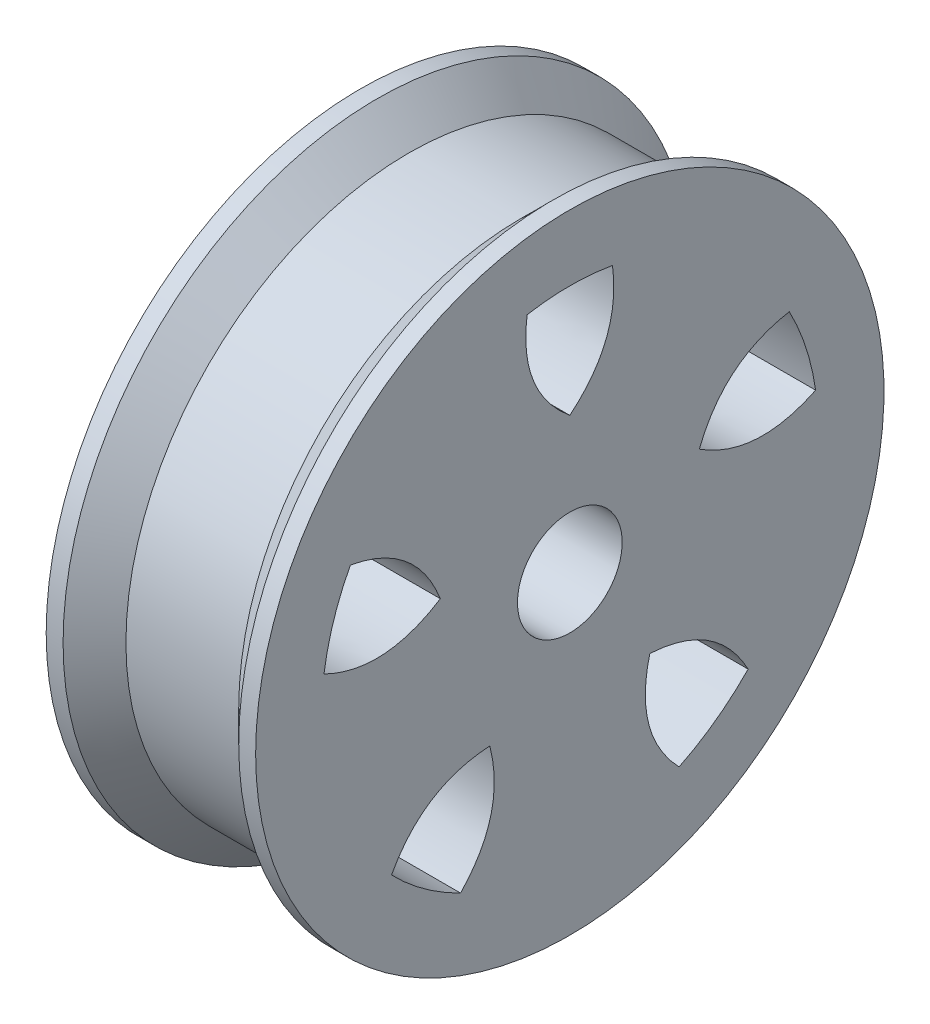
ISO-10303-21;
HEADER;
FILE_DESCRIPTION(('STEP AP214'),'2;1');
FILE_NAME('part.step','',(''),(''),'','','');
FILE_SCHEMA(('AUTOMOTIVE_DESIGN { 1 0 10303 214 1 1 1 1 }'));
ENDSEC;
DATA;
#1=APPLICATION_CONTEXT('core data for automotive mechanical design processes');
#2=APPLICATION_PROTOCOL_DEFINITION('international standard','automotive_design',2000,#1);
#3=PRODUCT_CONTEXT('',#1,'mechanical');
#4=PRODUCT('Part','Part','',(#3));
#5=PRODUCT_RELATED_PRODUCT_CATEGORY('part','',(#4));
#6=PRODUCT_DEFINITION_FORMATION('','',#4);
#7=PRODUCT_DEFINITION_CONTEXT('part definition',#1,'design');
#8=PRODUCT_DEFINITION('design','',#6,#7);
#9=PRODUCT_DEFINITION_SHAPE('','',#8);
#10=(LENGTH_UNIT() NAMED_UNIT(*) SI_UNIT(.MILLI.,.METRE.));
#11=(NAMED_UNIT(*) PLANE_ANGLE_UNIT() SI_UNIT($,.RADIAN.));
#12=(NAMED_UNIT(*) SI_UNIT($,.STERADIAN.) SOLID_ANGLE_UNIT());
#13=UNCERTAINTY_MEASURE_WITH_UNIT(LENGTH_MEASURE(1.E-05),#10,'distance_accuracy_value','');
#14=(GEOMETRIC_REPRESENTATION_CONTEXT(3) GLOBAL_UNCERTAINTY_ASSIGNED_CONTEXT((#13)) GLOBAL_UNIT_ASSIGNED_CONTEXT((#10,
#11,#12)) REPRESENTATION_CONTEXT('',''));
#15=CARTESIAN_POINT('',(0.,0.,0.));
#16=DIRECTION('',(0.,0.,1.));
#17=DIRECTION('',(1.,0.,0.));
#18=AXIS2_PLACEMENT_3D('',#15,#16,#17);
#19=CARTESIAN_POINT('',(3.,13.,0.));
#20=DIRECTION('',(1.,0.,0.));
#21=DIRECTION('',(0.,0.,-1.));
#22=AXIS2_PLACEMENT_3D('',#19,#20,#21);
#23=PLANE('',#22);
#24=CARTESIAN_POINT('',(3.,0.,0.));
#25=DIRECTION('',(-1.,0.,0.));
#26=DIRECTION('',(0.,0.,1.));
#27=AXIS2_PLACEMENT_3D('',#24,#25,#26);
#28=CIRCLE('',#27,13.);
#29=CARTESIAN_POINT('',(3.,4.01722092687444,12.3637347118369));
#30=VERTEX_POINT('',#29);
#31=CARTESIAN_POINT('',(3.,13.,0.));
#32=VERTEX_POINT('',#31);
#33=EDGE_CURVE('E150',#30,#32,#28,.T.);
#34=ORIENTED_EDGE('',*,*,#33,.F.);
#35=CARTESIAN_POINT('',(3.,11.0933574603183,20.9541045179935));
#36=CARTESIAN_POINT('',(3.,9.96753337147774,14.7007536655509));
#37=CARTESIAN_POINT('',(3.,4.01722092687444,12.3637347118369));
#38=B_SPLINE_CURVE_WITH_KNOTS('',2,(#35,#36,#37),.UNSPECIFIED.,.F.,.F.,(3,3),(0.,1.),.UNSPECIFIED.);
#39=CARTESIAN_POINT('',(3.,11.0933574603183,20.9541045179935));
#40=VERTEX_POINT('',#39);
#41=EDGE_CURVE('E129',#40,#30,#38,.T.);
#42=ORIENTED_EDGE('',*,*,#41,.F.);
#43=CARTESIAN_POINT('',(3.,0.,0.));
#44=DIRECTION('',(-1.,0.,0.));
#45=DIRECTION('',(0.,0.,1.));
#46=AXIS2_PLACEMENT_3D('',#43,#44,#45);
#47=CIRCLE('',#46,23.709430104779);
#48=CARTESIAN_POINT('',(3.,23.356573624882,4.07523550225805));
#49=VERTEX_POINT('',#48);
#50=EDGE_CURVE('E217',#40,#49,#47,.T.);
#51=ORIENTED_EDGE('',*,*,#50,.T.);
#52=CARTESIAN_POINT('',(3.,13.,0.));
#53=CARTESIAN_POINT('',(3.,17.0613847718581,4.93690485155809));
#54=CARTESIAN_POINT('',(3.,23.356573624882,4.07523550225805));
#55=B_SPLINE_CURVE_WITH_KNOTS('',2,(#52,#53,#54),.UNSPECIFIED.,.F.,.F.,(3,3),(0.,1.),.UNSPECIFIED.);
#56=EDGE_CURVE('E152',#32,#49,#55,.T.);
#57=ORIENTED_EDGE('',*,*,#56,.F.);
#58=EDGE_LOOP('',(#34,#42,#51,#57));
#59=FACE_BOUND('',#58,.T.);
#60=ADVANCED_FACE('F16',(#59),#23,.F.);
#61=CARTESIAN_POINT('',(3.,-16.5005016650531,17.025584298196));
#62=VERTEX_POINT('',#61);
#63=CARTESIAN_POINT('',(3.,3.3417989005986,23.4727385705493));
#64=VERTEX_POINT('',#63);
#65=EDGE_CURVE('E147',#62,#64,#47,.T.);
#66=ORIENTED_EDGE('',*,*,#65,.T.);
#67=CARTESIAN_POINT('',(3.,4.01722092687444,12.3637347118369));
#68=CARTESIAN_POINT('',(3.,0.576982312670811,17.7519286630382));
#69=CARTESIAN_POINT('',(3.,3.3417989005986,23.4727385705493));
#70=B_SPLINE_CURVE_WITH_KNOTS('',2,(#67,#68,#69),.UNSPECIFIED.,.F.,.F.,(3,3),(0.,1.),.UNSPECIFIED.);
#71=EDGE_CURVE('E38',#30,#64,#70,.T.);
#72=ORIENTED_EDGE('',*,*,#71,.F.);
#73=CARTESIAN_POINT('',(3.,-10.5172209268742,7.64120827980223));
#74=VERTEX_POINT('',#73);
#75=EDGE_CURVE('E144',#74,#30,#28,.T.);
#76=ORIENTED_EDGE('',*,*,#75,.F.);
#77=CARTESIAN_POINT('',(3.,-16.5005016650531,17.025584298196));
#78=CARTESIAN_POINT('',(3.,-10.901110364286,14.0224702771083));
#79=CARTESIAN_POINT('',(3.,-10.5172209268742,7.64120827980223));
#80=B_SPLINE_CURVE_WITH_KNOTS('',2,(#77,#78,#79),.UNSPECIFIED.,.F.,.F.,(3,3),(0.,1.),.UNSPECIFIED.);
#81=EDGE_CURVE('E250',#62,#74,#80,.T.);
#82=ORIENTED_EDGE('',*,*,#81,.F.);
#83=EDGE_LOOP('',(#66,#72,#76,#82));
#84=FACE_BOUND('',#83,.T.);
#85=ADVANCED_FACE('F141',(#84),#23,.F.);
#86=CARTESIAN_POINT('',(3.,-21.2912283207453,-10.431714743382));
#87=VERTEX_POINT('',#86);
#88=CARTESIAN_POINT('',(3.,-21.2912283207451,10.4317147433823));
#89=VERTEX_POINT('',#88);
#90=EDGE_CURVE('E211',#87,#89,#47,.T.);
#91=ORIENTED_EDGE('',*,*,#90,.T.);
#92=CARTESIAN_POINT('',(3.,-10.5172209268742,7.64120827980223));
#93=CARTESIAN_POINT('',(3.,-16.7047900917201,6.0343904280631));
#94=CARTESIAN_POINT('',(3.,-21.2912283207451,10.4317147433823));
#95=B_SPLINE_CURVE_WITH_KNOTS('',2,(#92,#93,#94),.UNSPECIFIED.,.F.,.F.,(3,3),(0.,1.),.UNSPECIFIED.);
#96=EDGE_CURVE('E431',#74,#89,#95,.T.);
#97=ORIENTED_EDGE('',*,*,#96,.F.);
#98=CARTESIAN_POINT('',(3.,-10.5172209268743,-7.64120827980207));
#99=VERTEX_POINT('',#98);
#100=EDGE_CURVE('E163',#99,#74,#28,.T.);
#101=ORIENTED_EDGE('',*,*,#100,.F.);
#102=CARTESIAN_POINT('',(3.,-21.2912283207453,-10.431714743382));
#103=CARTESIAN_POINT('',(3.,-16.7047900917202,-6.03439042806286));
#104=CARTESIAN_POINT('',(3.,-10.5172209268743,-7.64120827980207));
#105=B_SPLINE_CURVE_WITH_KNOTS('',2,(#102,#103,#104),.UNSPECIFIED.,.F.,.F.,(3,3),(0.,1.),.UNSPECIFIED.);
#106=EDGE_CURVE('E294',#87,#99,#105,.T.);
#107=ORIENTED_EDGE('',*,*,#106,.F.);
#108=EDGE_LOOP('',(#91,#97,#101,#107));
#109=FACE_BOUND('',#108,.T.);
#110=ADVANCED_FACE('F430',(#109),#23,.F.);
#111=CARTESIAN_POINT('',(3.,3.34179890059827,-23.4727385705494));
#112=VERTEX_POINT('',#111);
#113=CARTESIAN_POINT('',(3.,-16.5005016650533,-17.0255842981958));
#114=VERTEX_POINT('',#113);
#115=EDGE_CURVE('E207',#112,#114,#47,.T.);
#116=ORIENTED_EDGE('',*,*,#115,.T.);
#117=CARTESIAN_POINT('',(3.,-10.5172209268743,-7.64120827980207));
#118=CARTESIAN_POINT('',(3.,-10.9011103642862,-14.0224702771081));
#119=CARTESIAN_POINT('',(3.,-16.5005016650533,-17.0255842981958));
#120=B_SPLINE_CURVE_WITH_KNOTS('',2,(#117,#118,#119),.UNSPECIFIED.,.F.,.F.,(3,3),(0.,1.),.UNSPECIFIED.);
#121=EDGE_CURVE('E302',#99,#114,#120,.T.);
#122=ORIENTED_EDGE('',*,*,#121,.F.);
#123=CARTESIAN_POINT('',(3.,4.01722092687427,-12.363734711837));
#124=VERTEX_POINT('',#123);
#125=EDGE_CURVE('E164',#124,#99,#28,.T.);
#126=ORIENTED_EDGE('',*,*,#125,.F.);
#127=CARTESIAN_POINT('',(3.,3.34179890059827,-23.4727385705495));
#128=CARTESIAN_POINT('',(3.,0.576982312670559,-17.7519286630382));
#129=CARTESIAN_POINT('',(3.,4.01722092687427,-12.363734711837));
#130=B_SPLINE_CURVE_WITH_KNOTS('',2,(#127,#128,#129),.UNSPECIFIED.,.F.,.F.,(3,3),(0.,1.),.UNSPECIFIED.);
#131=EDGE_CURVE('E326',#112,#124,#130,.T.);
#132=ORIENTED_EDGE('',*,*,#131,.F.);
#133=EDGE_LOOP('',(#116,#122,#126,#132));
#134=FACE_BOUND('',#133,.T.);
#135=ADVANCED_FACE('F471',(#134),#23,.F.);
#136=CARTESIAN_POINT('',(3.,23.356573624882,-4.07523550225805));
#137=VERTEX_POINT('',#136);
#138=CARTESIAN_POINT('',(3.,11.093357460318,-20.9541045179937));
#139=VERTEX_POINT('',#138);
#140=EDGE_CURVE('E196',#137,#139,#47,.T.);
#141=ORIENTED_EDGE('',*,*,#140,.T.);
#142=CARTESIAN_POINT('',(3.,4.01722092687427,-12.363734711837));
#143=CARTESIAN_POINT('',(3.,9.96753337147753,-14.700753665551));
#144=CARTESIAN_POINT('',(3.,11.093357460318,-20.9541045179937));
#145=B_SPLINE_CURVE_WITH_KNOTS('',2,(#142,#143,#144),.UNSPECIFIED.,.F.,.F.,(3,3),(0.,1.),.UNSPECIFIED.);
#146=EDGE_CURVE('E740',#124,#139,#145,.T.);
#147=ORIENTED_EDGE('',*,*,#146,.F.);
#148=EDGE_CURVE('E159',#32,#124,#28,.T.);
#149=ORIENTED_EDGE('',*,*,#148,.F.);
#150=CARTESIAN_POINT('',(3.,23.356573624882,-4.07523550225805));
#151=CARTESIAN_POINT('',(3.,17.0613847718581,-4.93690485155809));
#152=CARTESIAN_POINT('',(3.,13.,0.));
#153=B_SPLINE_CURVE_WITH_KNOTS('',2,(#150,#151,#152),.UNSPECIFIED.,.F.,.F.,(3,3),(0.,1.),.UNSPECIFIED.);
#154=EDGE_CURVE('E382',#137,#32,#153,.T.);
#155=ORIENTED_EDGE('',*,*,#154,.F.);
#156=EDGE_LOOP('',(#141,#147,#149,#155));
#157=FACE_BOUND('',#156,.T.);
#158=ADVANCED_FACE('F412',(#157),#23,.F.);
#159=CARTESIAN_POINT('',(0.,0.,0.));
#160=DIRECTION('',(-1.,0.,0.));
#161=DIRECTION('',(0.,0.,1.));
#162=AXIS2_PLACEMENT_3D('',#159,#160,#161);
#163=CYLINDRICAL_SURFACE('',#162,30.);
#164=CARTESIAN_POINT('',(0.,0.,0.));
#165=DIRECTION('',(-1.,0.,0.));
#166=DIRECTION('',(0.,0.,1.));
#167=AXIS2_PLACEMENT_3D('',#164,#165,#166);
#168=CIRCLE('',#167,30.);
#169=CARTESIAN_POINT('',(0.,0.,30.));
#170=VERTEX_POINT('',#169);
#171=EDGE_CURVE('E389',#170,#170,#168,.T.);
#172=ORIENTED_EDGE('',*,*,#171,.F.);
#173=EDGE_LOOP('',(#172));
#174=FACE_BOUND('',#173,.T.);
#175=CARTESIAN_POINT('',(1.61417223726469,0.,0.));
#176=DIRECTION('',(-1.,0.,0.));
#177=DIRECTION('',(0.,0.,1.));
#178=AXIS2_PLACEMENT_3D('',#175,#176,#177);
#179=CIRCLE('',#178,30.);
#180=CARTESIAN_POINT('',(1.61417223726469,0.,30.));
#181=VERTEX_POINT('',#180);
#182=EDGE_CURVE('E190',#181,#181,#179,.T.);
#183=ORIENTED_EDGE('',*,*,#182,.T.);
#184=EDGE_LOOP('',(#183));
#185=FACE_BOUND('',#184,.T.);
#186=ADVANCED_FACE('F18',(#174,#185),#163,.T.);
#187=CARTESIAN_POINT('',(4.61417223726468,0.,0.));
#188=DIRECTION('',(-1.,0.,0.));
#189=DIRECTION('',(0.,0.,1.));
#190=AXIS2_PLACEMENT_3D('',#187,#188,#189);
#191=CONICAL_SURFACE('',#190,27.,0.785398163397452);
#192=ORIENTED_EDGE('',*,*,#182,.F.);
#193=EDGE_LOOP('',(#192));
#194=FACE_BOUND('',#193,.T.);
#195=CARTESIAN_POINT('',(4.61417223726468,0.,0.));
#196=DIRECTION('',(-1.,0.,0.));
#197=DIRECTION('',(0.,0.,1.));
#198=AXIS2_PLACEMENT_3D('',#195,#196,#197);
#199=CIRCLE('',#198,27.);
#200=CARTESIAN_POINT('',(4.61417223726468,0.,27.));
#201=VERTEX_POINT('',#200);
#202=EDGE_CURVE('E187',#201,#201,#199,.T.);
#203=ORIENTED_EDGE('',*,*,#202,.T.);
#204=EDGE_LOOP('',(#203));
#205=FACE_BOUND('',#204,.T.);
#206=ADVANCED_FACE('F477',(#194,#205),#191,.T.);
#207=CARTESIAN_POINT('',(0.,0.,0.));
#208=DIRECTION('',(-1.,0.,0.));
#209=DIRECTION('',(0.,0.,1.));
#210=AXIS2_PLACEMENT_3D('',#207,#208,#209);
#211=CYLINDRICAL_SURFACE('',#210,27.);
#212=ORIENTED_EDGE('',*,*,#202,.F.);
#213=EDGE_LOOP('',(#212));
#214=FACE_BOUND('',#213,.T.);
#215=CARTESIAN_POINT('',(15.3858277627353,0.,0.));
#216=DIRECTION('',(-1.,0.,0.));
#217=DIRECTION('',(0.,0.,1.));
#218=AXIS2_PLACEMENT_3D('',#215,#216,#217);
#219=CIRCLE('',#218,27.);
#220=CARTESIAN_POINT('',(15.3858277627353,0.,27.));
#221=VERTEX_POINT('',#220);
#222=EDGE_CURVE('E184',#221,#221,#219,.T.);
#223=ORIENTED_EDGE('',*,*,#222,.T.);
#224=EDGE_LOOP('',(#223));
#225=FACE_BOUND('',#224,.T.);
#226=ADVANCED_FACE('F524',(#214,#225),#211,.T.);
#227=CARTESIAN_POINT('',(18.3858277627353,0.,0.));
#228=DIRECTION('',(1.,0.,0.));
#229=DIRECTION('',(0.,0.,-1.));
#230=AXIS2_PLACEMENT_3D('',#227,#228,#229);
#231=CONICAL_SURFACE('',#230,30.,0.78539816339745);
#232=ORIENTED_EDGE('',*,*,#222,.F.);
#233=EDGE_LOOP('',(#232));
#234=FACE_BOUND('',#233,.T.);
#235=CARTESIAN_POINT('',(18.3858277627353,0.,0.));
#236=DIRECTION('',(-1.,0.,0.));
#237=DIRECTION('',(0.,0.,1.));
#238=AXIS2_PLACEMENT_3D('',#235,#236,#237);
#239=CIRCLE('',#238,30.);
#240=CARTESIAN_POINT('',(18.3858277627353,0.,30.));
#241=VERTEX_POINT('',#240);
#242=EDGE_CURVE('E181',#241,#241,#239,.T.);
#243=ORIENTED_EDGE('',*,*,#242,.T.);
#244=EDGE_LOOP('',(#243));
#245=FACE_BOUND('',#244,.T.);
#246=ADVANCED_FACE('F532',(#234,#245),#231,.T.);
#247=CARTESIAN_POINT('',(0.,0.,0.));
#248=DIRECTION('',(-1.,0.,0.));
#249=DIRECTION('',(0.,0.,1.));
#250=AXIS2_PLACEMENT_3D('',#247,#248,#249);
#251=CYLINDRICAL_SURFACE('',#250,30.);
#252=ORIENTED_EDGE('',*,*,#242,.F.);
#253=EDGE_LOOP('',(#252));
#254=FACE_BOUND('',#253,.T.);
#255=CARTESIAN_POINT('',(20.,0.,0.));
#256=DIRECTION('',(-1.,0.,0.));
#257=DIRECTION('',(0.,0.,1.));
#258=AXIS2_PLACEMENT_3D('',#255,#256,#257);
#259=CIRCLE('',#258,30.);
#260=CARTESIAN_POINT('',(20.,0.,30.));
#261=VERTEX_POINT('',#260);
#262=EDGE_CURVE('E178',#261,#261,#259,.T.);
#263=ORIENTED_EDGE('',*,*,#262,.T.);
#264=EDGE_LOOP('',(#263));
#265=FACE_BOUND('',#264,.T.);
#266=ADVANCED_FACE('F541',(#254,#265),#251,.T.);
#267=CARTESIAN_POINT('',(20.,30.,0.));
#268=DIRECTION('',(-1.,0.,0.));
#269=DIRECTION('',(0.,0.,1.));
#270=AXIS2_PLACEMENT_3D('',#267,#268,#269);
#271=PLANE('',#270);
#272=CARTESIAN_POINT('',(20.,0.,0.));
#273=DIRECTION('',(-1.,0.,0.));
#274=DIRECTION('',(0.,0.,1.));
#275=AXIS2_PLACEMENT_3D('',#272,#273,#274);
#276=CIRCLE('',#275,23.709430104779);
#277=CARTESIAN_POINT('',(20.,3.3417989005986,23.4727385705493));
#278=VERTEX_POINT('',#277);
#279=CARTESIAN_POINT('',(20.,11.0933574603183,20.9541045179935));
#280=VERTEX_POINT('',#279);
#281=EDGE_CURVE('E245',#278,#280,#276,.T.);
#282=ORIENTED_EDGE('',*,*,#281,.T.);
#283=CARTESIAN_POINT('',(20.,11.0933574603183,20.9541045179935));
#284=CARTESIAN_POINT('',(20.,9.96753337147774,14.7007536655509));
#285=CARTESIAN_POINT('',(20.,4.01722092687444,12.3637347118369));
#286=B_SPLINE_CURVE_WITH_KNOTS('',2,(#283,#284,#285),.UNSPECIFIED.,.F.,.F.,(3,3),(0.,1.),.UNSPECIFIED.);
#287=CARTESIAN_POINT('',(20.,4.01722092687444,12.3637347118369));
#288=VERTEX_POINT('',#287);
#289=EDGE_CURVE('E10',#280,#288,#286,.T.);
#290=ORIENTED_EDGE('',*,*,#289,.T.);
#291=CARTESIAN_POINT('',(20.,4.01722092687444,12.3637347118369));
#292=CARTESIAN_POINT('',(20.,0.576982312670811,17.7519286630382));
#293=CARTESIAN_POINT('',(20.,3.3417989005986,23.4727385705493));
#294=B_SPLINE_CURVE_WITH_KNOTS('',2,(#291,#292,#293),.UNSPECIFIED.,.F.,.F.,(3,3),(0.,1.),.UNSPECIFIED.);
#295=EDGE_CURVE('E26',#288,#278,#294,.T.);
#296=ORIENTED_EDGE('',*,*,#295,.T.);
#297=EDGE_LOOP('',(#282,#290,#296));
#298=FACE_BOUND('',#297,.T.);
#299=CARTESIAN_POINT('',(20.,0.,0.));
#300=DIRECTION('',(-1.,0.,0.));
#301=DIRECTION('',(0.,0.,1.));
#302=AXIS2_PLACEMENT_3D('',#299,#300,#301);
#303=CIRCLE('',#302,23.709430104779);
#304=CARTESIAN_POINT('',(20.,-21.2912283207451,10.4317147433823));
#305=VERTEX_POINT('',#304);
#306=CARTESIAN_POINT('',(20.,-16.5005016650531,17.025584298196));
#307=VERTEX_POINT('',#306);
#308=EDGE_CURVE('E303',#305,#307,#303,.T.);
#309=ORIENTED_EDGE('',*,*,#308,.T.);
#310=CARTESIAN_POINT('',(20.,-16.5005016650531,17.025584298196));
#311=CARTESIAN_POINT('',(20.,-10.901110364286,14.0224702771083));
#312=CARTESIAN_POINT('',(20.,-10.5172209268742,7.64120827980223));
#313=B_SPLINE_CURVE_WITH_KNOTS('',2,(#310,#311,#312),.UNSPECIFIED.,.F.,.F.,(3,3),(0.,1.),.UNSPECIFIED.);
#314=CARTESIAN_POINT('',(20.,-10.5172209268742,7.64120827980223));
#315=VERTEX_POINT('',#314);
#316=EDGE_CURVE('E226',#307,#315,#313,.T.);
#317=ORIENTED_EDGE('',*,*,#316,.T.);
#318=CARTESIAN_POINT('',(20.,-10.5172209268742,7.64120827980223));
#319=CARTESIAN_POINT('',(20.,-16.7047900917201,6.0343904280631));
#320=CARTESIAN_POINT('',(20.,-21.2912283207451,10.4317147433823));
#321=B_SPLINE_CURVE_WITH_KNOTS('',2,(#318,#319,#320),.UNSPECIFIED.,.F.,.F.,(3,3),(0.,1.),.UNSPECIFIED.);
#322=EDGE_CURVE('E221',#315,#305,#321,.T.);
#323=ORIENTED_EDGE('',*,*,#322,.T.);
#324=EDGE_LOOP('',(#309,#317,#323));
#325=FACE_BOUND('',#324,.T.);
#326=CARTESIAN_POINT('',(20.,0.,0.));
#327=DIRECTION('',(-1.,0.,0.));
#328=DIRECTION('',(0.,0.,1.));
#329=AXIS2_PLACEMENT_3D('',#326,#327,#328);
#330=CIRCLE('',#329,23.709430104779);
#331=CARTESIAN_POINT('',(20.,-16.5005016650533,-17.0255842981958));
#332=VERTEX_POINT('',#331);
#333=CARTESIAN_POINT('',(20.,-21.2912283207453,-10.431714743382));
#334=VERTEX_POINT('',#333);
#335=EDGE_CURVE('E319',#332,#334,#330,.T.);
#336=ORIENTED_EDGE('',*,*,#335,.T.);
#337=CARTESIAN_POINT('',(20.,-21.2912283207453,-10.431714743382));
#338=CARTESIAN_POINT('',(20.,-16.7047900917202,-6.03439042806286));
#339=CARTESIAN_POINT('',(20.,-10.5172209268743,-7.64120827980207));
#340=B_SPLINE_CURVE_WITH_KNOTS('',2,(#337,#338,#339),.UNSPECIFIED.,.F.,.F.,(3,3),(0.,1.),.UNSPECIFIED.);
#341=CARTESIAN_POINT('',(20.,-10.5172209268743,-7.64120827980207));
#342=VERTEX_POINT('',#341);
#343=EDGE_CURVE('E218',#334,#342,#340,.T.);
#344=ORIENTED_EDGE('',*,*,#343,.T.);
#345=CARTESIAN_POINT('',(20.,-10.5172209268743,-7.64120827980207));
#346=CARTESIAN_POINT('',(20.,-10.9011103642862,-14.0224702771081));
#347=CARTESIAN_POINT('',(20.,-16.5005016650533,-17.0255842981958));
#348=B_SPLINE_CURVE_WITH_KNOTS('',2,(#345,#346,#347),.UNSPECIFIED.,.F.,.F.,(3,3),(0.,1.),.UNSPECIFIED.);
#349=EDGE_CURVE('E736',#342,#332,#348,.T.);
#350=ORIENTED_EDGE('',*,*,#349,.T.);
#351=EDGE_LOOP('',(#336,#344,#350));
#352=FACE_BOUND('',#351,.T.);
#353=CARTESIAN_POINT('',(20.,0.,0.));
#354=DIRECTION('',(-1.,0.,0.));
#355=DIRECTION('',(0.,0.,1.));
#356=AXIS2_PLACEMENT_3D('',#353,#354,#355);
#357=CIRCLE('',#356,23.709430104779);
#358=CARTESIAN_POINT('',(20.,11.093357460318,-20.9541045179937));
#359=VERTEX_POINT('',#358);
#360=CARTESIAN_POINT('',(20.,3.34179890059827,-23.4727385705494));
#361=VERTEX_POINT('',#360);
#362=EDGE_CURVE('E384',#359,#361,#357,.T.);
#363=ORIENTED_EDGE('',*,*,#362,.T.);
#364=CARTESIAN_POINT('',(20.,3.34179890059827,-23.4727385705495));
#365=CARTESIAN_POINT('',(20.,0.576982312670559,-17.7519286630382));
#366=CARTESIAN_POINT('',(20.,4.01722092687427,-12.363734711837));
#367=B_SPLINE_CURVE_WITH_KNOTS('',2,(#364,#365,#366),.UNSPECIFIED.,.F.,.F.,(3,3),(0.,1.),.UNSPECIFIED.);
#368=CARTESIAN_POINT('',(20.,4.01722092687427,-12.363734711837));
#369=VERTEX_POINT('',#368);
#370=EDGE_CURVE('E766',#361,#369,#367,.T.);
#371=ORIENTED_EDGE('',*,*,#370,.T.);
#372=CARTESIAN_POINT('',(20.,4.01722092687427,-12.363734711837));
#373=CARTESIAN_POINT('',(20.,9.96753337147753,-14.700753665551));
#374=CARTESIAN_POINT('',(20.,11.093357460318,-20.9541045179937));
#375=B_SPLINE_CURVE_WITH_KNOTS('',2,(#372,#373,#374),.UNSPECIFIED.,.F.,.F.,(3,3),(0.,1.),.UNSPECIFIED.);
#376=EDGE_CURVE('E193',#369,#359,#375,.T.);
#377=ORIENTED_EDGE('',*,*,#376,.T.);
#378=EDGE_LOOP('',(#363,#371,#377));
#379=FACE_BOUND('',#378,.T.);
#380=CARTESIAN_POINT('',(20.,0.,0.));
#381=DIRECTION('',(-1.,0.,0.));
#382=DIRECTION('',(0.,0.,1.));
#383=AXIS2_PLACEMENT_3D('',#380,#381,#382);
#384=CIRCLE('',#383,23.709430104779);
#385=CARTESIAN_POINT('',(20.,23.356573624882,4.07523550225805));
#386=VERTEX_POINT('',#385);
#387=CARTESIAN_POINT('',(20.,23.356573624882,-4.07523550225805));
#388=VERTEX_POINT('',#387);
#389=EDGE_CURVE('E363',#386,#388,#384,.T.);
#390=ORIENTED_EDGE('',*,*,#389,.T.);
#391=CARTESIAN_POINT('',(20.,23.356573624882,-4.07523550225805));
#392=CARTESIAN_POINT('',(20.,17.0613847718581,-4.93690485155809));
#393=CARTESIAN_POINT('',(20.,13.,0.));
#394=B_SPLINE_CURVE_WITH_KNOTS('',2,(#391,#392,#393),.UNSPECIFIED.,.F.,.F.,(3,3),(0.,1.),.UNSPECIFIED.);
#395=CARTESIAN_POINT('',(20.,13.,0.));
#396=VERTEX_POINT('',#395);
#397=EDGE_CURVE('E364',#388,#396,#394,.T.);
#398=ORIENTED_EDGE('',*,*,#397,.T.);
#399=CARTESIAN_POINT('',(20.,13.,0.));
#400=CARTESIAN_POINT('',(20.,17.0613847718581,4.93690485155809));
#401=CARTESIAN_POINT('',(20.,23.356573624882,4.07523550225805));
#402=B_SPLINE_CURVE_WITH_KNOTS('',2,(#399,#400,#401),.UNSPECIFIED.,.F.,.F.,(3,3),(0.,1.),.UNSPECIFIED.);
#403=EDGE_CURVE('E357',#396,#386,#402,.T.);
#404=ORIENTED_EDGE('',*,*,#403,.T.);
#405=EDGE_LOOP('',(#390,#398,#404));
#406=FACE_BOUND('',#405,.T.);
#407=ORIENTED_EDGE('',*,*,#262,.F.);
#408=EDGE_LOOP('',(#407));
#409=FACE_BOUND('',#408,.T.);
#410=CARTESIAN_POINT('',(20.,0.,0.));
#411=DIRECTION('',(-1.,0.,0.));
#412=DIRECTION('',(0.,0.,1.));
#413=AXIS2_PLACEMENT_3D('',#410,#411,#412);
#414=CIRCLE('',#413,5.);
#415=CARTESIAN_POINT('',(20.,0.,5.));
#416=VERTEX_POINT('',#415);
#417=EDGE_CURVE('E175',#416,#416,#414,.T.);
#418=ORIENTED_EDGE('',*,*,#417,.T.);
#419=EDGE_LOOP('',(#418));
#420=FACE_BOUND('',#419,.T.);
#421=ADVANCED_FACE('F243',(#298,#325,#352,#379,#406,#409,#420),#271,.F.);
#422=CARTESIAN_POINT('',(0.,0.,0.));
#423=DIRECTION('',(-1.,0.,0.));
#424=DIRECTION('',(0.,0.,1.));
#425=AXIS2_PLACEMENT_3D('',#422,#423,#424);
#426=CYLINDRICAL_SURFACE('',#425,5.);
#427=ORIENTED_EDGE('',*,*,#417,.F.);
#428=EDGE_LOOP('',(#427));
#429=FACE_BOUND('',#428,.T.);
#430=CARTESIAN_POINT('',(0.,0.,0.));
#431=DIRECTION('',(-1.,0.,0.));
#432=DIRECTION('',(0.,0.,1.));
#433=AXIS2_PLACEMENT_3D('',#430,#431,#432);
#434=CIRCLE('',#433,5.);
#435=CARTESIAN_POINT('',(0.,0.,5.));
#436=VERTEX_POINT('',#435);
#437=EDGE_CURVE('E172',#436,#436,#434,.T.);
#438=ORIENTED_EDGE('',*,*,#437,.T.);
#439=EDGE_LOOP('',(#438));
#440=FACE_BOUND('',#439,.T.);
#441=ADVANCED_FACE('F558',(#429,#440),#426,.F.);
#442=CARTESIAN_POINT('',(0.,5.,0.));
#443=DIRECTION('',(1.,0.,0.));
#444=DIRECTION('',(0.,0.,-1.));
#445=AXIS2_PLACEMENT_3D('',#442,#443,#444);
#446=PLANE('',#445);
#447=ORIENTED_EDGE('',*,*,#437,.F.);
#448=EDGE_LOOP('',(#447));
#449=FACE_BOUND('',#448,.T.);
#450=CARTESIAN_POINT('',(0.,0.,0.));
#451=DIRECTION('',(-1.,0.,0.));
#452=DIRECTION('',(0.,0.,1.));
#453=AXIS2_PLACEMENT_3D('',#450,#451,#452);
#454=CIRCLE('',#453,10.);
#455=CARTESIAN_POINT('',(0.,0.,10.));
#456=VERTEX_POINT('',#455);
#457=EDGE_CURVE('E167',#456,#456,#454,.T.);
#458=ORIENTED_EDGE('',*,*,#457,.T.);
#459=EDGE_LOOP('',(#458));
#460=FACE_BOUND('',#459,.T.);
#461=ADVANCED_FACE('F566',(#449,#460),#446,.F.);
#462=CARTESIAN_POINT('',(3.,0.,0.));
#463=DIRECTION('',(1.,0.,0.));
#464=DIRECTION('',(0.,0.,-1.));
#465=AXIS2_PLACEMENT_3D('',#462,#463,#464);
#466=CONICAL_SURFACE('',#465,13.,0.785398163397443);
#467=ORIENTED_EDGE('',*,*,#457,.F.);
#468=EDGE_LOOP('',(#467));
#469=FACE_BOUND('',#468,.T.);
#470=ORIENTED_EDGE('',*,*,#148,.T.);
#471=ORIENTED_EDGE('',*,*,#125,.T.);
#472=ORIENTED_EDGE('',*,*,#100,.T.);
#473=ORIENTED_EDGE('',*,*,#75,.T.);
#474=ORIENTED_EDGE('',*,*,#33,.T.);
#475=EDGE_LOOP('',(#470,#471,#472,#473,#474));
#476=FACE_BOUND('',#475,.T.);
#477=ADVANCED_FACE('F160',(#469,#476),#466,.T.);
#478=CARTESIAN_POINT('',(0.,0.,0.));
#479=DIRECTION('',(-1.,0.,0.));
#480=DIRECTION('',(0.,0.,1.));
#481=AXIS2_PLACEMENT_3D('',#478,#479,#480);
#482=CONICAL_SURFACE('',#481,26.709430104779,0.78539816339745);
#483=EDGE_CURVE('E157',#49,#137,#47,.T.);
#484=ORIENTED_EDGE('',*,*,#483,.F.);
#485=ORIENTED_EDGE('',*,*,#50,.F.);
#486=CARTESIAN_POINT('',(3.,0.,0.));
#487=DIRECTION('',(-1.,0.,0.));
#488=DIRECTION('',(0.,-0.95105651629515,0.309016994374958));
#489=AXIS2_PLACEMENT_3D('',#486,#487,#488);
#490=CIRCLE('',#489,23.709430104779);
#491=EDGE_CURVE('E126',#64,#40,#490,.T.);
#492=ORIENTED_EDGE('',*,*,#491,.F.);
#493=ORIENTED_EDGE('',*,*,#65,.F.);
#494=CARTESIAN_POINT('',(3.,0.,0.));
#495=DIRECTION('',(-1.,0.,0.));
#496=DIRECTION('',(0.,-0.58778525229248,-0.809016994374942));
#497=AXIS2_PLACEMENT_3D('',#494,#495,#496);
#498=CIRCLE('',#497,23.709430104779);
#499=EDGE_CURVE('E435',#89,#62,#498,.T.);
#500=ORIENTED_EDGE('',*,*,#499,.F.);
#501=ORIENTED_EDGE('',*,*,#90,.F.);
#502=CARTESIAN_POINT('',(3.,0.,0.));
#503=DIRECTION('',(-1.,0.,0.));
#504=DIRECTION('',(0.,0.587785252292469,-0.809016994374951));
#505=AXIS2_PLACEMENT_3D('',#502,#503,#504);
#506=CIRCLE('',#505,23.709430104779);
#507=EDGE_CURVE('E310',#114,#87,#506,.T.);
#508=ORIENTED_EDGE('',*,*,#507,.F.);
#509=ORIENTED_EDGE('',*,*,#115,.F.);
#510=CARTESIAN_POINT('',(3.,0.,0.));
#511=DIRECTION('',(-1.,0.,0.));
#512=DIRECTION('',(0.,0.951056516295155,0.309016994374945));
#513=AXIS2_PLACEMENT_3D('',#510,#511,#512);
#514=CIRCLE('',#513,23.709430104779);
#515=EDGE_CURVE('E420',#139,#112,#514,.T.);
#516=ORIENTED_EDGE('',*,*,#515,.F.);
#517=ORIENTED_EDGE('',*,*,#140,.F.);
#518=EDGE_LOOP('',(#484,#485,#492,#493,#500,#501,#508,#509,#516,#517));
#519=FACE_BOUND('',#518,.T.);
#520=CARTESIAN_POINT('',(0.,0.,0.));
#521=DIRECTION('',(-1.,0.,0.));
#522=DIRECTION('',(0.,0.,1.));
#523=AXIS2_PLACEMENT_3D('',#520,#521,#522);
#524=CIRCLE('',#523,26.709430104779);
#525=CARTESIAN_POINT('',(0.,0.,26.709430104779));
#526=VERTEX_POINT('',#525);
#527=EDGE_CURVE('E168',#526,#526,#524,.T.);
#528=ORIENTED_EDGE('',*,*,#527,.T.);
#529=EDGE_LOOP('',(#528));
#530=FACE_BOUND('',#529,.T.);
#531=ADVANCED_FACE('F416',(#519,#530),#482,.F.);
#532=CARTESIAN_POINT('',(0.,26.709430104779,0.));
#533=DIRECTION('',(1.,0.,0.));
#534=DIRECTION('',(0.,0.,-1.));
#535=AXIS2_PLACEMENT_3D('',#532,#533,#534);
#536=PLANE('',#535);
#537=ORIENTED_EDGE('',*,*,#527,.F.);
#538=EDGE_LOOP('',(#537));
#539=FACE_BOUND('',#538,.T.);
#540=ORIENTED_EDGE('',*,*,#171,.T.);
#541=EDGE_LOOP('',(#540));
#542=FACE_BOUND('',#541,.T.);
#543=ADVANCED_FACE('F590',(#539,#542),#536,.F.);
#544=DIRECTION('',(-1.,0.,0.));
#545=VECTOR('',#544,1.);
#546=SURFACE_OF_LINEAR_EXTRUSION('',#394,#545);
#547=ORIENTED_EDGE('',*,*,#154,.T.);
#548=DIRECTION('',(-1.,0.,0.));
#549=VECTOR('',#548,1.);
#550=CARTESIAN_POINT('',(20.,13.,0.));
#551=LINE('',#550,#549);
#552=EDGE_CURVE('E374',#396,#32,#551,.T.);
#553=ORIENTED_EDGE('',*,*,#552,.F.);
#554=ORIENTED_EDGE('',*,*,#397,.F.);
#555=DIRECTION('',(-1.,0.,0.));
#556=VECTOR('',#555,1.);
#557=CARTESIAN_POINT('',(20.,23.356573624882,-4.07523550225805));
#558=LINE('',#557,#556);
#559=EDGE_CURVE('E387',#388,#137,#558,.T.);
#560=ORIENTED_EDGE('',*,*,#559,.T.);
#561=EDGE_LOOP('',(#547,#553,#554,#560));
#562=FACE_BOUND('',#561,.T.);
#563=ADVANCED_FACE('F349',(#562),#546,.F.);
#564=CARTESIAN_POINT('',(20.,0.,0.));
#565=DIRECTION('',(-1.,0.,0.));
#566=DIRECTION('',(0.,0.,1.));
#567=AXIS2_PLACEMENT_3D('',#564,#565,#566);
#568=CYLINDRICAL_SURFACE('',#567,23.709430104779);
#569=ORIENTED_EDGE('',*,*,#483,.T.);
#570=ORIENTED_EDGE('',*,*,#559,.F.);
#571=ORIENTED_EDGE('',*,*,#389,.F.);
#572=DIRECTION('',(-1.,0.,0.));
#573=VECTOR('',#572,1.);
#574=CARTESIAN_POINT('',(20.,23.356573624882,4.07523550225805));
#575=LINE('',#574,#573);
#576=EDGE_CURVE('E390',#386,#49,#575,.T.);
#577=ORIENTED_EDGE('',*,*,#576,.T.);
#578=EDGE_LOOP('',(#569,#570,#571,#577));
#579=FACE_BOUND('',#578,.T.);
#580=ADVANCED_FACE('F346',(#579),#568,.F.);
#581=DIRECTION('',(-1.,0.,0.));
#582=VECTOR('',#581,1.);
#583=SURFACE_OF_LINEAR_EXTRUSION('',#402,#582);
#584=ORIENTED_EDGE('',*,*,#56,.T.);
#585=ORIENTED_EDGE('',*,*,#576,.F.);
#586=ORIENTED_EDGE('',*,*,#403,.F.);
#587=ORIENTED_EDGE('',*,*,#552,.T.);
#588=EDGE_LOOP('',(#584,#585,#586,#587));
#589=FACE_BOUND('',#588,.T.);
#590=ADVANCED_FACE('F344',(#589),#583,.F.);
#591=CARTESIAN_POINT('',(20.000025,3.34179890059827,-23.4727385705495));
#592=CARTESIAN_POINT('',(20.000025,0.576982312670559,-17.7519286630382));
#593=CARTESIAN_POINT('',(20.000025,4.01722092687427,-12.363734711837));
#594=B_SPLINE_CURVE_WITH_KNOTS('',2,(#591,#592,#593),.UNSPECIFIED.,.F.,.F.,(3,3),(0.,1.),.UNSPECIFIED.);
#595=DIRECTION('',(-1.,0.,0.));
#596=VECTOR('',#595,1.);
#597=SURFACE_OF_LINEAR_EXTRUSION('',#594,#596);
#598=DIRECTION('',(-1.,0.,0.));
#599=VECTOR('',#598,1.);
#600=CARTESIAN_POINT('',(20.000025,3.34179890059827,-23.4727385705494));
#601=LINE('',#600,#599);
#602=EDGE_CURVE('E755',#361,#112,#601,.T.);
#603=ORIENTED_EDGE('',*,*,#602,.T.);
#604=ORIENTED_EDGE('',*,*,#131,.T.);
#605=DIRECTION('',(-1.,0.,0.));
#606=VECTOR('',#605,1.);
#607=CARTESIAN_POINT('',(20.000025,4.01722092687427,-12.363734711837));
#608=LINE('',#607,#606);
#609=EDGE_CURVE('E754',#369,#124,#608,.T.);
#610=ORIENTED_EDGE('',*,*,#609,.F.);
#611=ORIENTED_EDGE('',*,*,#370,.F.);
#612=EDGE_LOOP('',(#603,#604,#610,#611));
#613=FACE_BOUND('',#612,.T.);
#614=ADVANCED_FACE('F339',(#613),#597,.F.);
#615=CARTESIAN_POINT('',(20.000025,4.01722092687427,-12.363734711837));
#616=CARTESIAN_POINT('',(20.000025,9.96753337147753,-14.700753665551));
#617=CARTESIAN_POINT('',(20.000025,11.093357460318,-20.9541045179937));
#618=B_SPLINE_CURVE_WITH_KNOTS('',2,(#615,#616,#617),.UNSPECIFIED.,.F.,.F.,(3,3),(0.,1.),.UNSPECIFIED.);
#619=DIRECTION('',(-1.,0.,0.));
#620=VECTOR('',#619,1.);
#621=SURFACE_OF_LINEAR_EXTRUSION('',#618,#620);
#622=ORIENTED_EDGE('',*,*,#609,.T.);
#623=ORIENTED_EDGE('',*,*,#146,.T.);
#624=DIRECTION('',(-1.,0.,0.));
#625=VECTOR('',#624,1.);
#626=CARTESIAN_POINT('',(20.000025,11.093357460318,-20.9541045179937));
#627=LINE('',#626,#625);
#628=EDGE_CURVE('E757',#359,#139,#627,.T.);
#629=ORIENTED_EDGE('',*,*,#628,.F.);
#630=ORIENTED_EDGE('',*,*,#376,.F.);
#631=EDGE_LOOP('',(#622,#623,#629,#630));
#632=FACE_BOUND('',#631,.T.);
#633=ADVANCED_FACE('F343',(#632),#621,.F.);
#634=CARTESIAN_POINT('',(20.000025,0.,0.));
#635=DIRECTION('',(-1.,0.,0.));
#636=DIRECTION('',(0.,0.,1.));
#637=AXIS2_PLACEMENT_3D('',#634,#635,#636);
#638=CYLINDRICAL_SURFACE('',#637,23.709430104779);
#639=ORIENTED_EDGE('',*,*,#628,.T.);
#640=ORIENTED_EDGE('',*,*,#515,.T.);
#641=ORIENTED_EDGE('',*,*,#602,.F.);
#642=ORIENTED_EDGE('',*,*,#362,.F.);
#643=EDGE_LOOP('',(#639,#640,#641,#642));
#644=FACE_BOUND('',#643,.T.);
#645=ADVANCED_FACE('F624',(#644),#638,.F.);
#646=CARTESIAN_POINT('',(20.000025,-21.2912283207453,-10.431714743382));
#647=CARTESIAN_POINT('',(20.000025,-16.7047900917202,-6.03439042806286));
#648=CARTESIAN_POINT('',(20.000025,-10.5172209268743,-7.64120827980207));
#649=B_SPLINE_CURVE_WITH_KNOTS('',2,(#646,#647,#648),.UNSPECIFIED.,.F.,.F.,(3,3),(0.,1.),.UNSPECIFIED.);
#650=DIRECTION('',(-1.,0.,0.));
#651=VECTOR('',#650,1.);
#652=SURFACE_OF_LINEAR_EXTRUSION('',#649,#651);
#653=DIRECTION('',(-1.,0.,0.));
#654=VECTOR('',#653,1.);
#655=CARTESIAN_POINT('',(20.000025,-21.2912283207453,-10.431714743382));
#656=LINE('',#655,#654);
#657=EDGE_CURVE('E317',#334,#87,#656,.T.);
#658=ORIENTED_EDGE('',*,*,#657,.T.);
#659=ORIENTED_EDGE('',*,*,#106,.T.);
#660=DIRECTION('',(-1.,0.,0.));
#661=VECTOR('',#660,1.);
#662=CARTESIAN_POINT('',(20.000025,-10.5172209268743,-7.64120827980207));
#663=LINE('',#662,#661);
#664=EDGE_CURVE('E316',#342,#99,#663,.T.);
#665=ORIENTED_EDGE('',*,*,#664,.F.);
#666=ORIENTED_EDGE('',*,*,#343,.F.);
#667=EDGE_LOOP('',(#658,#659,#665,#666));
#668=FACE_BOUND('',#667,.T.);
#669=ADVANCED_FACE('F282',(#668),#652,.F.);
#670=CARTESIAN_POINT('',(20.000025,-10.5172209268743,-7.64120827980207));
#671=CARTESIAN_POINT('',(20.000025,-10.9011103642862,-14.0224702771081));
#672=CARTESIAN_POINT('',(20.000025,-16.5005016650533,-17.0255842981958));
#673=B_SPLINE_CURVE_WITH_KNOTS('',2,(#670,#671,#672),.UNSPECIFIED.,.F.,.F.,(3,3),(0.,1.),.UNSPECIFIED.);
#674=DIRECTION('',(-1.,0.,0.));
#675=VECTOR('',#674,1.);
#676=SURFACE_OF_LINEAR_EXTRUSION('',#673,#675);
#677=ORIENTED_EDGE('',*,*,#664,.T.);
#678=ORIENTED_EDGE('',*,*,#121,.T.);
#679=DIRECTION('',(-1.,0.,0.));
#680=VECTOR('',#679,1.);
#681=CARTESIAN_POINT('',(20.000025,-16.5005016650533,-17.0255842981958));
#682=LINE('',#681,#680);
#683=EDGE_CURVE('E320',#332,#114,#682,.T.);
#684=ORIENTED_EDGE('',*,*,#683,.F.);
#685=ORIENTED_EDGE('',*,*,#349,.F.);
#686=EDGE_LOOP('',(#677,#678,#684,#685));
#687=FACE_BOUND('',#686,.T.);
#688=ADVANCED_FACE('F277',(#687),#676,.F.);
#689=CARTESIAN_POINT('',(20.000025,0.,0.));
#690=DIRECTION('',(-1.,0.,0.));
#691=DIRECTION('',(0.,0.,1.));
#692=AXIS2_PLACEMENT_3D('',#689,#690,#691);
#693=CYLINDRICAL_SURFACE('',#692,23.709430104779);
#694=ORIENTED_EDGE('',*,*,#683,.T.);
#695=ORIENTED_EDGE('',*,*,#507,.T.);
#696=ORIENTED_EDGE('',*,*,#657,.F.);
#697=ORIENTED_EDGE('',*,*,#335,.F.);
#698=EDGE_LOOP('',(#694,#695,#696,#697));
#699=FACE_BOUND('',#698,.T.);
#700=ADVANCED_FACE('F272',(#699),#693,.F.);
#701=CARTESIAN_POINT('',(20.000025,-16.5005016650531,17.025584298196));
#702=CARTESIAN_POINT('',(20.000025,-10.901110364286,14.0224702771083));
#703=CARTESIAN_POINT('',(20.000025,-10.5172209268742,7.64120827980223));
#704=B_SPLINE_CURVE_WITH_KNOTS('',2,(#701,#702,#703),.UNSPECIFIED.,.F.,.F.,(3,3),(0.,1.),.UNSPECIFIED.);
#705=DIRECTION('',(-1.,0.,0.));
#706=VECTOR('',#705,1.);
#707=SURFACE_OF_LINEAR_EXTRUSION('',#704,#706);
#708=DIRECTION('',(-1.,0.,0.));
#709=VECTOR('',#708,1.);
#710=CARTESIAN_POINT('',(20.000025,-16.5005016650531,17.025584298196));
#711=LINE('',#710,#709);
#712=EDGE_CURVE('E447',#307,#62,#711,.T.);
#713=ORIENTED_EDGE('',*,*,#712,.T.);
#714=ORIENTED_EDGE('',*,*,#81,.T.);
#715=DIRECTION('',(-1.,0.,0.));
#716=VECTOR('',#715,1.);
#717=CARTESIAN_POINT('',(20.000025,-10.5172209268742,7.64120827980223));
#718=LINE('',#717,#716);
#719=EDGE_CURVE('E439',#315,#74,#718,.T.);
#720=ORIENTED_EDGE('',*,*,#719,.F.);
#721=ORIENTED_EDGE('',*,*,#316,.F.);
#722=EDGE_LOOP('',(#713,#714,#720,#721));
#723=FACE_BOUND('',#722,.T.);
#724=ADVANCED_FACE('F267',(#723),#707,.F.);
#725=CARTESIAN_POINT('',(20.000025,-10.5172209268742,7.64120827980223));
#726=CARTESIAN_POINT('',(20.000025,-16.7047900917201,6.0343904280631));
#727=CARTESIAN_POINT('',(20.000025,-21.2912283207451,10.4317147433823));
#728=B_SPLINE_CURVE_WITH_KNOTS('',2,(#725,#726,#727),.UNSPECIFIED.,.F.,.F.,(3,3),(0.,1.),.UNSPECIFIED.);
#729=DIRECTION('',(-1.,0.,0.));
#730=VECTOR('',#729,1.);
#731=SURFACE_OF_LINEAR_EXTRUSION('',#728,#730);
#732=ORIENTED_EDGE('',*,*,#719,.T.);
#733=ORIENTED_EDGE('',*,*,#96,.T.);
#734=DIRECTION('',(-1.,0.,0.));
#735=VECTOR('',#734,1.);
#736=CARTESIAN_POINT('',(20.000025,-21.2912283207451,10.4317147433823));
#737=LINE('',#736,#735);
#738=EDGE_CURVE('E441',#305,#89,#737,.T.);
#739=ORIENTED_EDGE('',*,*,#738,.F.);
#740=ORIENTED_EDGE('',*,*,#322,.F.);
#741=EDGE_LOOP('',(#732,#733,#739,#740));
#742=FACE_BOUND('',#741,.T.);
#743=ADVANCED_FACE('F271',(#742),#731,.F.);
#744=CARTESIAN_POINT('',(20.000025,0.,0.));
#745=DIRECTION('',(-1.,0.,0.));
#746=DIRECTION('',(0.,0.,1.));
#747=AXIS2_PLACEMENT_3D('',#744,#745,#746);
#748=CYLINDRICAL_SURFACE('',#747,23.709430104779);
#749=ORIENTED_EDGE('',*,*,#738,.T.);
#750=ORIENTED_EDGE('',*,*,#499,.T.);
#751=ORIENTED_EDGE('',*,*,#712,.F.);
#752=ORIENTED_EDGE('',*,*,#308,.F.);
#753=EDGE_LOOP('',(#749,#750,#751,#752));
#754=FACE_BOUND('',#753,.T.);
#755=ADVANCED_FACE('F452',(#754),#748,.F.);
#756=CARTESIAN_POINT('',(20.000025,11.0933574603183,20.9541045179935));
#757=CARTESIAN_POINT('',(20.000025,9.96753337147774,14.7007536655509));
#758=CARTESIAN_POINT('',(20.000025,4.01722092687444,12.3637347118369));
#759=B_SPLINE_CURVE_WITH_KNOTS('',2,(#756,#757,#758),.UNSPECIFIED.,.F.,.F.,(3,3),(0.,1.),.UNSPECIFIED.);
#760=DIRECTION('',(-1.,0.,0.));
#761=VECTOR('',#760,1.);
#762=SURFACE_OF_LINEAR_EXTRUSION('',#759,#761);
#763=DIRECTION('',(-1.,0.,0.));
#764=VECTOR('',#763,1.);
#765=CARTESIAN_POINT('',(20.000025,11.0933574603183,20.9541045179935));
#766=LINE('',#765,#764);
#767=EDGE_CURVE('E132',#280,#40,#766,.T.);
#768=ORIENTED_EDGE('',*,*,#767,.T.);
#769=ORIENTED_EDGE('',*,*,#41,.T.);
#770=DIRECTION('',(-1.,0.,0.));
#771=VECTOR('',#770,1.);
#772=CARTESIAN_POINT('',(20.000025,4.01722092687444,12.3637347118369));
#773=LINE('',#772,#771);
#774=EDGE_CURVE('E121',#288,#30,#773,.T.);
#775=ORIENTED_EDGE('',*,*,#774,.F.);
#776=ORIENTED_EDGE('',*,*,#289,.F.);
#777=EDGE_LOOP('',(#768,#769,#775,#776));
#778=FACE_BOUND('',#777,.T.);
#779=ADVANCED_FACE('F130',(#778),#762,.F.);
#780=CARTESIAN_POINT('',(20.000025,4.01722092687444,12.3637347118369));
#781=CARTESIAN_POINT('',(20.000025,0.576982312670811,17.7519286630382));
#782=CARTESIAN_POINT('',(20.000025,3.3417989005986,23.4727385705493));
#783=B_SPLINE_CURVE_WITH_KNOTS('',2,(#780,#781,#782),.UNSPECIFIED.,.F.,.F.,(3,3),(0.,1.),.UNSPECIFIED.);
#784=DIRECTION('',(-1.,0.,0.));
#785=VECTOR('',#784,1.);
#786=SURFACE_OF_LINEAR_EXTRUSION('',#783,#785);
#787=ORIENTED_EDGE('',*,*,#774,.T.);
#788=ORIENTED_EDGE('',*,*,#71,.T.);
#789=DIRECTION('',(-1.,0.,0.));
#790=VECTOR('',#789,1.);
#791=CARTESIAN_POINT('',(20.000025,3.3417989005986,23.4727385705493));
#792=LINE('',#791,#790);
#793=EDGE_CURVE('E33',#278,#64,#792,.T.);
#794=ORIENTED_EDGE('',*,*,#793,.F.);
#795=ORIENTED_EDGE('',*,*,#295,.F.);
#796=EDGE_LOOP('',(#787,#788,#794,#795));
#797=FACE_BOUND('',#796,.T.);
#798=ADVANCED_FACE('F123',(#797),#786,.F.);
#799=CARTESIAN_POINT('',(20.000025,0.,0.));
#800=DIRECTION('',(-1.,0.,0.));
#801=DIRECTION('',(0.,0.,1.));
#802=AXIS2_PLACEMENT_3D('',#799,#800,#801);
#803=CYLINDRICAL_SURFACE('',#802,23.709430104779);
#804=ORIENTED_EDGE('',*,*,#793,.T.);
#805=ORIENTED_EDGE('',*,*,#491,.T.);
#806=ORIENTED_EDGE('',*,*,#767,.F.);
#807=ORIENTED_EDGE('',*,*,#281,.F.);
#808=EDGE_LOOP('',(#804,#805,#806,#807));
#809=FACE_BOUND('',#808,.T.);
#810=ADVANCED_FACE('F247',(#809),#803,.F.);
#811=CLOSED_SHELL('',(#60,#85,#110,#135,#158,#186,#206,#226,#246,#266,#421,#441,#461,#477,#531,
#543,#563,#580,#590,#614,#633,#645,#669,#688,#700,#724,#743,#755,#779,#798,#810));
#812=MANIFOLD_SOLID_BREP('B1',#811);
#813=ADVANCED_BREP_SHAPE_REPRESENTATION('',(#18,#812),#14);
#814=SHAPE_DEFINITION_REPRESENTATION(#9,#813);
ENDSEC;
END-ISO-10303-21;
